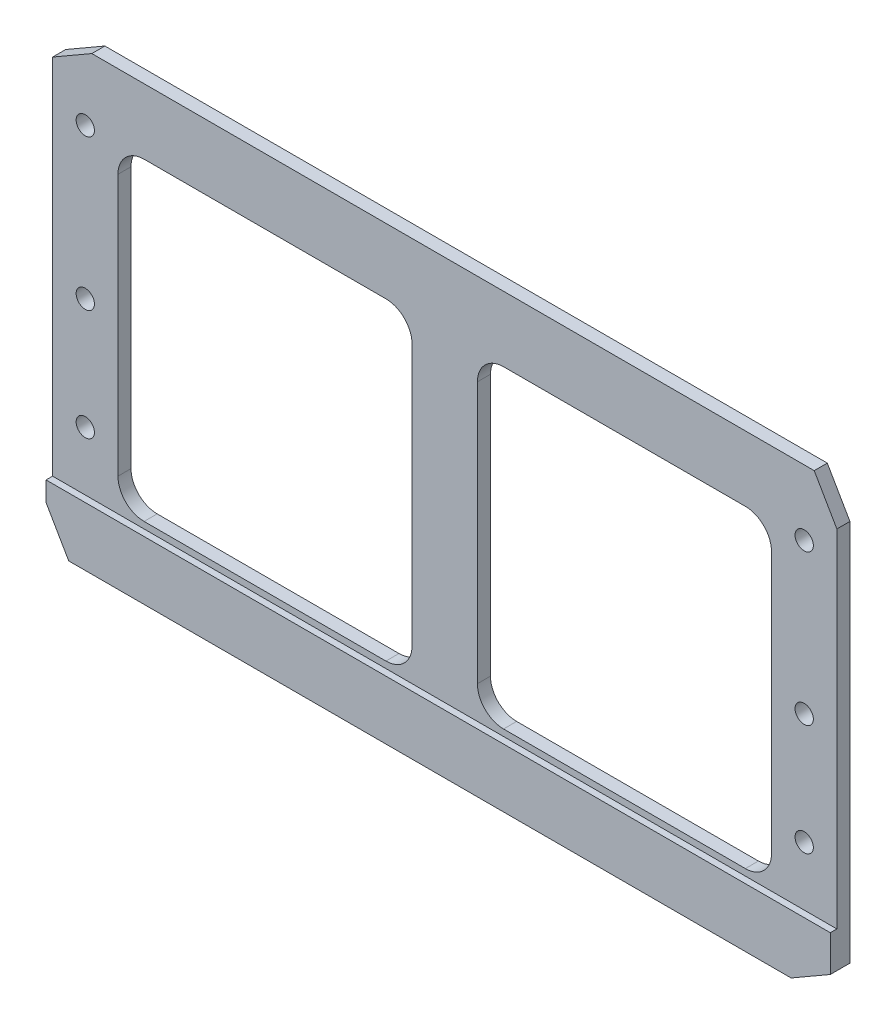
ISO-10303-21;
HEADER;
FILE_DESCRIPTION(('STEP AP214'),'2;1');
FILE_NAME('part.step','',(''),(''),'','','');
FILE_SCHEMA(('AUTOMOTIVE_DESIGN { 1 0 10303 214 1 1 1 1 }'));
ENDSEC;
DATA;
#1=APPLICATION_CONTEXT('core data for automotive mechanical design processes');
#2=APPLICATION_PROTOCOL_DEFINITION('international standard','automotive_design',2000,#1);
#3=PRODUCT_CONTEXT('',#1,'mechanical');
#4=PRODUCT('Part','Part','',(#3));
#5=PRODUCT_RELATED_PRODUCT_CATEGORY('part','',(#4));
#6=PRODUCT_DEFINITION_FORMATION('','',#4);
#7=PRODUCT_DEFINITION_CONTEXT('part definition',#1,'design');
#8=PRODUCT_DEFINITION('design','',#6,#7);
#9=PRODUCT_DEFINITION_SHAPE('','',#8);
#10=(LENGTH_UNIT() NAMED_UNIT(*) SI_UNIT(.MILLI.,.METRE.));
#11=(NAMED_UNIT(*) PLANE_ANGLE_UNIT() SI_UNIT($,.RADIAN.));
#12=(NAMED_UNIT(*) SI_UNIT($,.STERADIAN.) SOLID_ANGLE_UNIT());
#13=UNCERTAINTY_MEASURE_WITH_UNIT(LENGTH_MEASURE(1.E-05),#10,'distance_accuracy_value','');
#14=(GEOMETRIC_REPRESENTATION_CONTEXT(3) GLOBAL_UNCERTAINTY_ASSIGNED_CONTEXT((#13)) GLOBAL_UNIT_ASSIGNED_CONTEXT((#10,
#11,#12)) REPRESENTATION_CONTEXT('',''));
#15=CARTESIAN_POINT('',(0.,0.,0.));
#16=DIRECTION('',(0.,0.,1.));
#17=DIRECTION('',(1.,0.,0.));
#18=AXIS2_PLACEMENT_3D('',#15,#16,#17);
#19=CARTESIAN_POINT('',(-310.,-125.,10.));
#20=DIRECTION('',(0.,-1.,0.));
#21=DIRECTION('',(0.,0.,-1.));
#22=AXIS2_PLACEMENT_3D('',#19,#20,#21);
#23=PLANE('',#22);
#24=DIRECTION('',(0.,0.,-1.));
#25=VECTOR('',#24,1.);
#26=CARTESIAN_POINT('',(-300.,-125.,15.));
#27=LINE('',#26,#25);
#28=CARTESIAN_POINT('',(-300.,-125.,10.));
#29=VERTEX_POINT('',#28);
#30=CARTESIAN_POINT('',(-300.,-125.,15.));
#31=VERTEX_POINT('',#30);
#32=EDGE_CURVE('E185',#29,#31,#27,.F.);
#33=ORIENTED_EDGE('',*,*,#32,.T.);
#34=DIRECTION('',(-1.,0.,0.));
#35=VECTOR('',#34,1.);
#36=CARTESIAN_POINT('',(0.,-125.,15.));
#37=LINE('',#36,#35);
#38=CARTESIAN_POINT('',(300.,-125.,15.));
#39=VERTEX_POINT('',#38);
#40=EDGE_CURVE('E182',#31,#39,#37,.F.);
#41=ORIENTED_EDGE('',*,*,#40,.T.);
#42=DIRECTION('',(0.,0.,1.));
#43=VECTOR('',#42,1.);
#44=CARTESIAN_POINT('',(300.,-125.,15.));
#45=LINE('',#44,#43);
#46=CARTESIAN_POINT('',(300.,-125.,10.));
#47=VERTEX_POINT('',#46);
#48=EDGE_CURVE('E180',#39,#47,#45,.F.);
#49=ORIENTED_EDGE('',*,*,#48,.T.);
#50=DIRECTION('',(-1.,0.,0.));
#51=VECTOR('',#50,1.);
#52=CARTESIAN_POINT('',(0.,-125.,10.));
#53=LINE('',#52,#51);
#54=EDGE_CURVE('E189',#47,#29,#53,.T.);
#55=ORIENTED_EDGE('',*,*,#54,.T.);
#56=EDGE_LOOP('',(#33,#41,#49,#55));
#57=FACE_BOUND('',#56,.T.);
#58=ADVANCED_FACE('F16',(#57),#23,.F.);
#59=CARTESIAN_POINT('',(0.,0.,15.));
#60=DIRECTION('',(0.,0.,-1.));
#61=DIRECTION('',(-1.,0.,0.));
#62=AXIS2_PLACEMENT_3D('',#59,#60,#61);
#63=PLANE('',#62);
#64=ORIENTED_EDGE('',*,*,#40,.F.);
#65=DIRECTION('',(0.,1.,0.));
#66=VECTOR('',#65,1.);
#67=CARTESIAN_POINT('',(-300.,-170.,15.));
#68=LINE('',#67,#66);
#69=CARTESIAN_POINT('',(-300.,-140.,15.));
#70=VERTEX_POINT('',#69);
#71=EDGE_CURVE('E719',#31,#70,#68,.F.);
#72=ORIENTED_EDGE('',*,*,#71,.T.);
#73=DIRECTION('',(-0.5,0.86602540378444,0.));
#74=VECTOR('',#73,1.);
#75=CARTESIAN_POINT('',(-282.679491924312,-170.,15.));
#76=LINE('',#75,#74);
#77=CARTESIAN_POINT('',(-282.679491924312,-170.,15.));
#78=VERTEX_POINT('',#77);
#79=EDGE_CURVE('E728',#70,#78,#76,.F.);
#80=ORIENTED_EDGE('',*,*,#79,.T.);
#81=DIRECTION('',(1.,0.,0.));
#82=VECTOR('',#81,1.);
#83=CARTESIAN_POINT('',(-300.,-170.,15.));
#84=LINE('',#83,#82);
#85=CARTESIAN_POINT('',(270.,-170.,15.));
#86=VERTEX_POINT('',#85);
#87=EDGE_CURVE('E737',#78,#86,#84,.T.);
#88=ORIENTED_EDGE('',*,*,#87,.T.);
#89=DIRECTION('',(-0.866025403784439,-0.5,0.));
#90=VECTOR('',#89,1.);
#91=CARTESIAN_POINT('',(300.,-152.679491924311,15.));
#92=LINE('',#91,#90);
#93=CARTESIAN_POINT('',(300.,-152.679491924311,15.));
#94=VERTEX_POINT('',#93);
#95=EDGE_CURVE('E195',#86,#94,#92,.F.);
#96=ORIENTED_EDGE('',*,*,#95,.T.);
#97=DIRECTION('',(0.,1.,0.));
#98=VECTOR('',#97,1.);
#99=CARTESIAN_POINT('',(300.,-170.,15.));
#100=LINE('',#99,#98);
#101=EDGE_CURVE('E192',#94,#39,#100,.T.);
#102=ORIENTED_EDGE('',*,*,#101,.T.);
#103=EDGE_LOOP('',(#64,#72,#80,#88,#96,#102));
#104=FACE_BOUND('',#103,.T.);
#105=ADVANCED_FACE('F193',(#104),#63,.F.);
#106=CARTESIAN_POINT('',(0.,0.,10.));
#107=DIRECTION('',(0.,0.,-1.));
#108=DIRECTION('',(-1.,0.,0.));
#109=AXIS2_PLACEMENT_3D('',#106,#107,#108);
#110=PLANE('',#109);
#111=CARTESIAN_POINT('',(45.,100.,10.));
#112=DIRECTION('',(0.,0.,-1.));
#113=DIRECTION('',(-1.,0.,0.));
#114=AXIS2_PLACEMENT_3D('',#111,#112,#113);
#115=CIRCLE('',#114,20.);
#116=CARTESIAN_POINT('',(25.,100.,10.));
#117=VERTEX_POINT('',#116);
#118=CARTESIAN_POINT('',(45.,120.,10.));
#119=VERTEX_POINT('',#118);
#120=EDGE_CURVE('E299',#117,#119,#115,.T.);
#121=ORIENTED_EDGE('',*,*,#120,.T.);
#122=DIRECTION('',(-1.,0.,0.));
#123=VECTOR('',#122,1.);
#124=CARTESIAN_POINT('',(25.,120.,10.));
#125=LINE('',#124,#123);
#126=CARTESIAN_POINT('',(230.,120.,10.));
#127=VERTEX_POINT('',#126);
#128=EDGE_CURVE('E234',#119,#127,#125,.F.);
#129=ORIENTED_EDGE('',*,*,#128,.T.);
#130=CARTESIAN_POINT('',(230.,100.,10.));
#131=DIRECTION('',(0.,0.,-1.));
#132=DIRECTION('',(-1.,0.,0.));
#133=AXIS2_PLACEMENT_3D('',#130,#131,#132);
#134=CIRCLE('',#133,20.);
#135=CARTESIAN_POINT('',(250.,100.,10.));
#136=VERTEX_POINT('',#135);
#137=EDGE_CURVE('E301',#127,#136,#134,.T.);
#138=ORIENTED_EDGE('',*,*,#137,.T.);
#139=DIRECTION('',(0.,1.,0.));
#140=VECTOR('',#139,1.);
#141=CARTESIAN_POINT('',(250.,-120.,10.));
#142=LINE('',#141,#140);
#143=CARTESIAN_POINT('',(250.,-100.,10.));
#144=VERTEX_POINT('',#143);
#145=EDGE_CURVE('E132',#136,#144,#142,.F.);
#146=ORIENTED_EDGE('',*,*,#145,.T.);
#147=CARTESIAN_POINT('',(230.,-100.,10.));
#148=DIRECTION('',(0.,0.,-1.));
#149=DIRECTION('',(-1.,0.,0.));
#150=AXIS2_PLACEMENT_3D('',#147,#148,#149);
#151=CIRCLE('',#150,20.);
#152=CARTESIAN_POINT('',(230.,-120.,10.));
#153=VERTEX_POINT('',#152);
#154=EDGE_CURVE('E135',#144,#153,#151,.T.);
#155=ORIENTED_EDGE('',*,*,#154,.T.);
#156=DIRECTION('',(1.,0.,0.));
#157=VECTOR('',#156,1.);
#158=CARTESIAN_POINT('',(25.,-120.,10.));
#159=LINE('',#158,#157);
#160=CARTESIAN_POINT('',(45.,-120.,10.));
#161=VERTEX_POINT('',#160);
#162=EDGE_CURVE('E231',#153,#161,#159,.F.);
#163=ORIENTED_EDGE('',*,*,#162,.T.);
#164=CARTESIAN_POINT('',(45.,-100.,10.));
#165=DIRECTION('',(0.,0.,-1.));
#166=DIRECTION('',(-1.,0.,0.));
#167=AXIS2_PLACEMENT_3D('',#164,#165,#166);
#168=CIRCLE('',#167,20.);
#169=CARTESIAN_POINT('',(25.,-100.,10.));
#170=VERTEX_POINT('',#169);
#171=EDGE_CURVE('E296',#161,#170,#168,.T.);
#172=ORIENTED_EDGE('',*,*,#171,.T.);
#173=DIRECTION('',(0.,1.,0.));
#174=VECTOR('',#173,1.);
#175=CARTESIAN_POINT('',(25.,-120.,10.));
#176=LINE('',#175,#174);
#177=EDGE_CURVE('E227',#170,#117,#176,.T.);
#178=ORIENTED_EDGE('',*,*,#177,.T.);
#179=EDGE_LOOP('',(#121,#129,#138,#146,#155,#163,#172,#178));
#180=FACE_BOUND('',#179,.T.);
#181=DIRECTION('',(0.,1.,0.));
#182=VECTOR('',#181,1.);
#183=CARTESIAN_POINT('',(300.,-170.,10.));
#184=LINE('',#183,#182);
#185=CARTESIAN_POINT('',(300.,140.,10.));
#186=VERTEX_POINT('',#185);
#187=EDGE_CURVE('E144',#47,#186,#184,.T.);
#188=ORIENTED_EDGE('',*,*,#187,.T.);
#189=DIRECTION('',(0.5,-0.866025403784439,0.));
#190=VECTOR('',#189,1.);
#191=CARTESIAN_POINT('',(282.679491924311,170.,10.));
#192=LINE('',#191,#190);
#193=CARTESIAN_POINT('',(282.679491924311,170.,10.));
#194=VERTEX_POINT('',#193);
#195=EDGE_CURVE('E233',#186,#194,#192,.F.);
#196=ORIENTED_EDGE('',*,*,#195,.T.);
#197=DIRECTION('',(1.,0.,0.));
#198=VECTOR('',#197,1.);
#199=CARTESIAN_POINT('',(-300.,170.,10.));
#200=LINE('',#199,#198);
#201=CARTESIAN_POINT('',(-270.,170.,10.));
#202=VERTEX_POINT('',#201);
#203=EDGE_CURVE('E711',#194,#202,#200,.F.);
#204=ORIENTED_EDGE('',*,*,#203,.T.);
#205=DIRECTION('',(0.86602540378444,0.5,0.));
#206=VECTOR('',#205,1.);
#207=CARTESIAN_POINT('',(-300.,152.679491924311,10.));
#208=LINE('',#207,#206);
#209=CARTESIAN_POINT('',(-300.,152.679491924311,10.));
#210=VERTEX_POINT('',#209);
#211=EDGE_CURVE('E713',#202,#210,#208,.F.);
#212=ORIENTED_EDGE('',*,*,#211,.T.);
#213=DIRECTION('',(0.,1.,0.));
#214=VECTOR('',#213,1.);
#215=CARTESIAN_POINT('',(-300.,-170.,10.));
#216=LINE('',#215,#214);
#217=EDGE_CURVE('E722',#210,#29,#216,.F.);
#218=ORIENTED_EDGE('',*,*,#217,.T.);
#219=ORIENTED_EDGE('',*,*,#54,.F.);
#220=EDGE_LOOP('',(#188,#196,#204,#212,#218,#219));
#221=FACE_BOUND('',#220,.T.);
#222=CARTESIAN_POINT('',(-275.,5.,10.));
#223=DIRECTION('',(0.,0.,1.));
#224=DIRECTION('',(1.,0.,0.));
#225=AXIS2_PLACEMENT_3D('',#222,#223,#224);
#226=CIRCLE('',#225,7.);
#227=CARTESIAN_POINT('',(-268.,5.,10.));
#228=VERTEX_POINT('',#227);
#229=EDGE_CURVE('E306',#228,#228,#226,.F.);
#230=ORIENTED_EDGE('',*,*,#229,.T.);
#231=EDGE_LOOP('',(#230));
#232=FACE_BOUND('',#231,.T.);
#233=CARTESIAN_POINT('',(275.,120.,10.));
#234=DIRECTION('',(0.,0.,1.));
#235=DIRECTION('',(1.,0.,0.));
#236=AXIS2_PLACEMENT_3D('',#233,#234,#235);
#237=CIRCLE('',#236,7.);
#238=CARTESIAN_POINT('',(282.,120.,10.));
#239=VERTEX_POINT('',#238);
#240=EDGE_CURVE('E312',#239,#239,#237,.F.);
#241=ORIENTED_EDGE('',*,*,#240,.T.);
#242=EDGE_LOOP('',(#241));
#243=FACE_BOUND('',#242,.T.);
#244=CARTESIAN_POINT('',(275.,-80.,10.));
#245=DIRECTION('',(0.,0.,1.));
#246=DIRECTION('',(1.,0.,0.));
#247=AXIS2_PLACEMENT_3D('',#244,#245,#246);
#248=CIRCLE('',#247,7.);
#249=CARTESIAN_POINT('',(282.,-80.,10.));
#250=VERTEX_POINT('',#249);
#251=EDGE_CURVE('E19',#250,#250,#248,.F.);
#252=ORIENTED_EDGE('',*,*,#251,.T.);
#253=EDGE_LOOP('',(#252));
#254=FACE_BOUND('',#253,.T.);
#255=CARTESIAN_POINT('',(275.,5.00000000000009,10.));
#256=DIRECTION('',(0.,0.,1.));
#257=DIRECTION('',(1.,0.,0.));
#258=AXIS2_PLACEMENT_3D('',#255,#256,#257);
#259=CIRCLE('',#258,7.);
#260=CARTESIAN_POINT('',(282.,5.00000000000009,10.));
#261=VERTEX_POINT('',#260);
#262=EDGE_CURVE('E314',#261,#261,#259,.F.);
#263=ORIENTED_EDGE('',*,*,#262,.T.);
#264=EDGE_LOOP('',(#263));
#265=FACE_BOUND('',#264,.T.);
#266=CARTESIAN_POINT('',(-275.,-80.,10.));
#267=DIRECTION('',(0.,0.,1.));
#268=DIRECTION('',(1.,0.,0.));
#269=AXIS2_PLACEMENT_3D('',#266,#267,#268);
#270=CIRCLE('',#269,7.);
#271=CARTESIAN_POINT('',(-268.,-80.,10.));
#272=VERTEX_POINT('',#271);
#273=EDGE_CURVE('E309',#272,#272,#270,.F.);
#274=ORIENTED_EDGE('',*,*,#273,.T.);
#275=EDGE_LOOP('',(#274));
#276=FACE_BOUND('',#275,.T.);
#277=CARTESIAN_POINT('',(-275.,120.,10.));
#278=DIRECTION('',(0.,0.,1.));
#279=DIRECTION('',(1.,0.,0.));
#280=AXIS2_PLACEMENT_3D('',#277,#278,#279);
#281=CIRCLE('',#280,7.);
#282=CARTESIAN_POINT('',(-268.,120.,10.));
#283=VERTEX_POINT('',#282);
#284=EDGE_CURVE('E199',#283,#283,#281,.F.);
#285=ORIENTED_EDGE('',*,*,#284,.T.);
#286=EDGE_LOOP('',(#285));
#287=FACE_BOUND('',#286,.T.);
#288=CARTESIAN_POINT('',(-230.,-100.,10.));
#289=DIRECTION('',(0.,0.,-1.));
#290=DIRECTION('',(-1.,0.,0.));
#291=AXIS2_PLACEMENT_3D('',#288,#289,#290);
#292=CIRCLE('',#291,20.);
#293=CARTESIAN_POINT('',(-230.,-120.,10.));
#294=VERTEX_POINT('',#293);
#295=CARTESIAN_POINT('',(-250.,-100.,10.));
#296=VERTEX_POINT('',#295);
#297=EDGE_CURVE('E293',#294,#296,#292,.T.);
#298=ORIENTED_EDGE('',*,*,#297,.T.);
#299=DIRECTION('',(0.,1.,0.));
#300=VECTOR('',#299,1.);
#301=CARTESIAN_POINT('',(-250.,-120.,10.));
#302=LINE('',#301,#300);
#303=CARTESIAN_POINT('',(-250.,100.,10.));
#304=VERTEX_POINT('',#303);
#305=EDGE_CURVE('E222',#304,#296,#302,.F.);
#306=ORIENTED_EDGE('',*,*,#305,.F.);
#307=CARTESIAN_POINT('',(-230.,100.,10.));
#308=DIRECTION('',(0.,0.,-1.));
#309=DIRECTION('',(-1.,0.,0.));
#310=AXIS2_PLACEMENT_3D('',#307,#308,#309);
#311=CIRCLE('',#310,20.);
#312=CARTESIAN_POINT('',(-230.,120.,10.));
#313=VERTEX_POINT('',#312);
#314=EDGE_CURVE('E215',#304,#313,#311,.T.);
#315=ORIENTED_EDGE('',*,*,#314,.T.);
#316=DIRECTION('',(1.,0.,0.));
#317=VECTOR('',#316,1.);
#318=CARTESIAN_POINT('',(-25.,120.,10.));
#319=LINE('',#318,#317);
#320=CARTESIAN_POINT('',(-45.,120.,10.));
#321=VERTEX_POINT('',#320);
#322=EDGE_CURVE('E212',#321,#313,#319,.F.);
#323=ORIENTED_EDGE('',*,*,#322,.F.);
#324=CARTESIAN_POINT('',(-45.,100.,10.));
#325=DIRECTION('',(0.,0.,-1.));
#326=DIRECTION('',(-1.,0.,0.));
#327=AXIS2_PLACEMENT_3D('',#324,#325,#326);
#328=CIRCLE('',#327,20.);
#329=CARTESIAN_POINT('',(-25.,100.,10.));
#330=VERTEX_POINT('',#329);
#331=EDGE_CURVE('E288',#321,#330,#328,.T.);
#332=ORIENTED_EDGE('',*,*,#331,.T.);
#333=DIRECTION('',(0.,1.,0.));
#334=VECTOR('',#333,1.);
#335=CARTESIAN_POINT('',(-25.,-120.,10.));
#336=LINE('',#335,#334);
#337=CARTESIAN_POINT('',(-25.,-100.,10.));
#338=VERTEX_POINT('',#337);
#339=EDGE_CURVE('E207',#338,#330,#336,.T.);
#340=ORIENTED_EDGE('',*,*,#339,.F.);
#341=CARTESIAN_POINT('',(-45.,-100.,10.));
#342=DIRECTION('',(0.,0.,-1.));
#343=DIRECTION('',(-1.,0.,0.));
#344=AXIS2_PLACEMENT_3D('',#341,#342,#343);
#345=CIRCLE('',#344,20.);
#346=CARTESIAN_POINT('',(-45.,-120.,10.));
#347=VERTEX_POINT('',#346);
#348=EDGE_CURVE('E291',#338,#347,#345,.T.);
#349=ORIENTED_EDGE('',*,*,#348,.T.);
#350=DIRECTION('',(1.,0.,0.));
#351=VECTOR('',#350,1.);
#352=CARTESIAN_POINT('',(-25.,-120.,10.));
#353=LINE('',#352,#351);
#354=EDGE_CURVE('E217',#294,#347,#353,.T.);
#355=ORIENTED_EDGE('',*,*,#354,.F.);
#356=EDGE_LOOP('',(#298,#306,#315,#323,#332,#340,#349,#355));
#357=FACE_BOUND('',#356,.T.);
#358=ADVANCED_FACE('F321',(#180,#221,#232,#243,#254,#265,#276,#287,#357),#110,.F.);
#359=CARTESIAN_POINT('',(275.,-80.,15.));
#360=DIRECTION('',(0.,0.,1.));
#361=DIRECTION('',(1.,0.,0.));
#362=AXIS2_PLACEMENT_3D('',#359,#360,#361);
#363=CYLINDRICAL_SURFACE('',#362,7.);
#364=CARTESIAN_POINT('',(275.,-80.,0.));
#365=DIRECTION('',(0.,0.,1.));
#366=DIRECTION('',(1.,0.,0.));
#367=AXIS2_PLACEMENT_3D('',#364,#365,#366);
#368=CIRCLE('',#367,7.);
#369=CARTESIAN_POINT('',(282.,-80.,0.));
#370=VERTEX_POINT('',#369);
#371=EDGE_CURVE('E285',#370,#370,#368,.T.);
#372=ORIENTED_EDGE('',*,*,#371,.F.);
#373=EDGE_LOOP('',(#372));
#374=FACE_BOUND('',#373,.T.);
#375=ORIENTED_EDGE('',*,*,#251,.F.);
#376=EDGE_LOOP('',(#375));
#377=FACE_BOUND('',#376,.T.);
#378=ADVANCED_FACE('F323',(#374,#377),#363,.F.);
#379=CARTESIAN_POINT('',(275.,5.00000000000009,15.));
#380=DIRECTION('',(0.,0.,1.));
#381=DIRECTION('',(1.,0.,0.));
#382=AXIS2_PLACEMENT_3D('',#379,#380,#381);
#383=CYLINDRICAL_SURFACE('',#382,7.);
#384=CARTESIAN_POINT('',(275.,5.00000000000009,0.));
#385=DIRECTION('',(0.,0.,1.));
#386=DIRECTION('',(1.,0.,0.));
#387=AXIS2_PLACEMENT_3D('',#384,#385,#386);
#388=CIRCLE('',#387,7.);
#389=CARTESIAN_POINT('',(282.,5.00000000000009,0.));
#390=VERTEX_POINT('',#389);
#391=EDGE_CURVE('E282',#390,#390,#388,.T.);
#392=ORIENTED_EDGE('',*,*,#391,.F.);
#393=EDGE_LOOP('',(#392));
#394=FACE_BOUND('',#393,.T.);
#395=ORIENTED_EDGE('',*,*,#262,.F.);
#396=EDGE_LOOP('',(#395));
#397=FACE_BOUND('',#396,.T.);
#398=ADVANCED_FACE('F325',(#394,#397),#383,.F.);
#399=CARTESIAN_POINT('',(275.,120.,15.));
#400=DIRECTION('',(0.,0.,1.));
#401=DIRECTION('',(1.,0.,0.));
#402=AXIS2_PLACEMENT_3D('',#399,#400,#401);
#403=CYLINDRICAL_SURFACE('',#402,7.);
#404=CARTESIAN_POINT('',(275.,120.,0.));
#405=DIRECTION('',(0.,0.,1.));
#406=DIRECTION('',(1.,0.,0.));
#407=AXIS2_PLACEMENT_3D('',#404,#405,#406);
#408=CIRCLE('',#407,7.);
#409=CARTESIAN_POINT('',(282.,120.,0.));
#410=VERTEX_POINT('',#409);
#411=EDGE_CURVE('E279',#410,#410,#408,.T.);
#412=ORIENTED_EDGE('',*,*,#411,.F.);
#413=EDGE_LOOP('',(#412));
#414=FACE_BOUND('',#413,.T.);
#415=ORIENTED_EDGE('',*,*,#240,.F.);
#416=EDGE_LOOP('',(#415));
#417=FACE_BOUND('',#416,.T.);
#418=ADVANCED_FACE('F334',(#414,#417),#403,.F.);
#419=CARTESIAN_POINT('',(-275.,-80.,15.));
#420=DIRECTION('',(0.,0.,1.));
#421=DIRECTION('',(1.,0.,0.));
#422=AXIS2_PLACEMENT_3D('',#419,#420,#421);
#423=CYLINDRICAL_SURFACE('',#422,7.);
#424=CARTESIAN_POINT('',(-275.,-80.,0.));
#425=DIRECTION('',(0.,0.,1.));
#426=DIRECTION('',(1.,0.,0.));
#427=AXIS2_PLACEMENT_3D('',#424,#425,#426);
#428=CIRCLE('',#427,7.);
#429=CARTESIAN_POINT('',(-268.,-80.,0.));
#430=VERTEX_POINT('',#429);
#431=EDGE_CURVE('E276',#430,#430,#428,.T.);
#432=ORIENTED_EDGE('',*,*,#431,.F.);
#433=EDGE_LOOP('',(#432));
#434=FACE_BOUND('',#433,.T.);
#435=ORIENTED_EDGE('',*,*,#273,.F.);
#436=EDGE_LOOP('',(#435));
#437=FACE_BOUND('',#436,.T.);
#438=ADVANCED_FACE('F449',(#434,#437),#423,.F.);
#439=CARTESIAN_POINT('',(-275.,5.,15.));
#440=DIRECTION('',(0.,0.,1.));
#441=DIRECTION('',(1.,0.,0.));
#442=AXIS2_PLACEMENT_3D('',#439,#440,#441);
#443=CYLINDRICAL_SURFACE('',#442,7.);
#444=CARTESIAN_POINT('',(-275.,5.,0.));
#445=DIRECTION('',(0.,0.,1.));
#446=DIRECTION('',(1.,0.,0.));
#447=AXIS2_PLACEMENT_3D('',#444,#445,#446);
#448=CIRCLE('',#447,7.);
#449=CARTESIAN_POINT('',(-268.,5.,0.));
#450=VERTEX_POINT('',#449);
#451=EDGE_CURVE('E273',#450,#450,#448,.T.);
#452=ORIENTED_EDGE('',*,*,#451,.F.);
#453=EDGE_LOOP('',(#452));
#454=FACE_BOUND('',#453,.T.);
#455=ORIENTED_EDGE('',*,*,#229,.F.);
#456=EDGE_LOOP('',(#455));
#457=FACE_BOUND('',#456,.T.);
#458=ADVANCED_FACE('F445',(#454,#457),#443,.F.);
#459=CARTESIAN_POINT('',(-275.,120.,15.));
#460=DIRECTION('',(0.,0.,1.));
#461=DIRECTION('',(1.,0.,0.));
#462=AXIS2_PLACEMENT_3D('',#459,#460,#461);
#463=CYLINDRICAL_SURFACE('',#462,7.);
#464=CARTESIAN_POINT('',(-275.,120.,0.));
#465=DIRECTION('',(0.,0.,1.));
#466=DIRECTION('',(1.,0.,0.));
#467=AXIS2_PLACEMENT_3D('',#464,#465,#466);
#468=CIRCLE('',#467,7.);
#469=CARTESIAN_POINT('',(-268.,120.,0.));
#470=VERTEX_POINT('',#469);
#471=EDGE_CURVE('E269',#470,#470,#468,.T.);
#472=ORIENTED_EDGE('',*,*,#471,.F.);
#473=EDGE_LOOP('',(#472));
#474=FACE_BOUND('',#473,.T.);
#475=ORIENTED_EDGE('',*,*,#284,.F.);
#476=EDGE_LOOP('',(#475));
#477=FACE_BOUND('',#476,.T.);
#478=ADVANCED_FACE('F442',(#474,#477),#463,.F.);
#479=CARTESIAN_POINT('',(300.,-170.,15.));
#480=DIRECTION('',(-1.,0.,0.));
#481=DIRECTION('',(0.,0.,1.));
#482=AXIS2_PLACEMENT_3D('',#479,#480,#481);
#483=PLANE('',#482);
#484=ORIENTED_EDGE('',*,*,#48,.F.);
#485=ORIENTED_EDGE('',*,*,#101,.F.);
#486=DIRECTION('',(0.,0.,1.));
#487=VECTOR('',#486,1.);
#488=CARTESIAN_POINT('',(300.,-152.679491924311,15.));
#489=LINE('',#488,#487);
#490=CARTESIAN_POINT('',(300.,-152.679491924311,0.));
#491=VERTEX_POINT('',#490);
#492=EDGE_CURVE('E203',#94,#491,#489,.F.);
#493=ORIENTED_EDGE('',*,*,#492,.T.);
#494=DIRECTION('',(0.,1.,0.));
#495=VECTOR('',#494,1.);
#496=CARTESIAN_POINT('',(300.,0.,0.));
#497=LINE('',#496,#495);
#498=CARTESIAN_POINT('',(300.,140.,0.));
#499=VERTEX_POINT('',#498);
#500=EDGE_CURVE('E272',#499,#491,#497,.F.);
#501=ORIENTED_EDGE('',*,*,#500,.F.);
#502=DIRECTION('',(0.,0.,1.));
#503=VECTOR('',#502,1.);
#504=CARTESIAN_POINT('',(300.,140.,15.));
#505=LINE('',#504,#503);
#506=EDGE_CURVE('E703',#499,#186,#505,.T.);
#507=ORIENTED_EDGE('',*,*,#506,.T.);
#508=ORIENTED_EDGE('',*,*,#187,.F.);
#509=EDGE_LOOP('',(#484,#485,#493,#501,#507,#508));
#510=FACE_BOUND('',#509,.T.);
#511=ADVANCED_FACE('F201',(#510),#483,.F.);
#512=CARTESIAN_POINT('',(300.,-152.679491924311,15.));
#513=DIRECTION('',(-0.5,0.866025403784439,0.));
#514=DIRECTION('',(-0.866025403784439,-0.5,0.));
#515=AXIS2_PLACEMENT_3D('',#512,#513,#514);
#516=PLANE('',#515);
#517=DIRECTION('',(0.,0.,1.));
#518=VECTOR('',#517,1.);
#519=CARTESIAN_POINT('',(270.,-170.,15.));
#520=LINE('',#519,#518);
#521=CARTESIAN_POINT('',(270.,-170.,0.));
#522=VERTEX_POINT('',#521);
#523=EDGE_CURVE('E734',#86,#522,#520,.F.);
#524=ORIENTED_EDGE('',*,*,#523,.T.);
#525=DIRECTION('',(-0.866025403784439,-0.5,0.));
#526=VECTOR('',#525,1.);
#527=CARTESIAN_POINT('',(300.,-152.679491924311,0.));
#528=LINE('',#527,#526);
#529=EDGE_CURVE('E745',#491,#522,#528,.T.);
#530=ORIENTED_EDGE('',*,*,#529,.F.);
#531=ORIENTED_EDGE('',*,*,#492,.F.);
#532=ORIENTED_EDGE('',*,*,#95,.F.);
#533=EDGE_LOOP('',(#524,#530,#531,#532));
#534=FACE_BOUND('',#533,.T.);
#535=ADVANCED_FACE('F435',(#534),#516,.F.);
#536=CARTESIAN_POINT('',(-300.,-170.,15.));
#537=DIRECTION('',(0.,1.,0.));
#538=DIRECTION('',(0.,0.,1.));
#539=AXIS2_PLACEMENT_3D('',#536,#537,#538);
#540=PLANE('',#539);
#541=ORIENTED_EDGE('',*,*,#523,.F.);
#542=ORIENTED_EDGE('',*,*,#87,.F.);
#543=DIRECTION('',(0.,0.,1.));
#544=VECTOR('',#543,1.);
#545=CARTESIAN_POINT('',(-282.679491924312,-170.,15.));
#546=LINE('',#545,#544);
#547=CARTESIAN_POINT('',(-282.679491924312,-170.,0.));
#548=VERTEX_POINT('',#547);
#549=EDGE_CURVE('E731',#78,#548,#546,.F.);
#550=ORIENTED_EDGE('',*,*,#549,.T.);
#551=DIRECTION('',(-1.,0.,0.));
#552=VECTOR('',#551,1.);
#553=CARTESIAN_POINT('',(0.,-170.,0.));
#554=LINE('',#553,#552);
#555=EDGE_CURVE('E750',#522,#548,#554,.T.);
#556=ORIENTED_EDGE('',*,*,#555,.F.);
#557=EDGE_LOOP('',(#541,#542,#550,#556));
#558=FACE_BOUND('',#557,.T.);
#559=ADVANCED_FACE('F431',(#558),#540,.F.);
#560=CARTESIAN_POINT('',(-282.679491924312,-170.,15.));
#561=DIRECTION('',(0.86602540378444,0.5,0.));
#562=DIRECTION('',(-0.5,0.86602540378444,0.));
#563=AXIS2_PLACEMENT_3D('',#560,#561,#562);
#564=PLANE('',#563);
#565=DIRECTION('',(0.,0.,-1.));
#566=VECTOR('',#565,1.);
#567=CARTESIAN_POINT('',(-300.,-140.,15.));
#568=LINE('',#567,#566);
#569=CARTESIAN_POINT('',(-300.,-140.,0.));
#570=VERTEX_POINT('',#569);
#571=EDGE_CURVE('E725',#70,#570,#568,.T.);
#572=ORIENTED_EDGE('',*,*,#571,.T.);
#573=DIRECTION('',(-0.5,0.866025403784441,0.));
#574=VECTOR('',#573,1.);
#575=CARTESIAN_POINT('',(-282.679491924312,-170.,0.));
#576=LINE('',#575,#574);
#577=EDGE_CURVE('E792',#548,#570,#576,.T.);
#578=ORIENTED_EDGE('',*,*,#577,.F.);
#579=ORIENTED_EDGE('',*,*,#549,.F.);
#580=ORIENTED_EDGE('',*,*,#79,.F.);
#581=EDGE_LOOP('',(#572,#578,#579,#580));
#582=FACE_BOUND('',#581,.T.);
#583=ADVANCED_FACE('F427',(#582),#564,.F.);
#584=CARTESIAN_POINT('',(-300.,-170.,15.));
#585=DIRECTION('',(1.,0.,0.));
#586=DIRECTION('',(0.,0.,-1.));
#587=AXIS2_PLACEMENT_3D('',#584,#585,#586);
#588=PLANE('',#587);
#589=ORIENTED_EDGE('',*,*,#32,.F.);
#590=ORIENTED_EDGE('',*,*,#217,.F.);
#591=DIRECTION('',(0.,0.,1.));
#592=VECTOR('',#591,1.);
#593=CARTESIAN_POINT('',(-300.,152.679491924311,15.));
#594=LINE('',#593,#592);
#595=CARTESIAN_POINT('',(-300.,152.679491924311,0.));
#596=VERTEX_POINT('',#595);
#597=EDGE_CURVE('E716',#210,#596,#594,.F.);
#598=ORIENTED_EDGE('',*,*,#597,.T.);
#599=DIRECTION('',(0.,1.,0.));
#600=VECTOR('',#599,1.);
#601=CARTESIAN_POINT('',(-300.,0.,0.));
#602=LINE('',#601,#600);
#603=EDGE_CURVE('E789',#570,#596,#602,.T.);
#604=ORIENTED_EDGE('',*,*,#603,.F.);
#605=ORIENTED_EDGE('',*,*,#571,.F.);
#606=ORIENTED_EDGE('',*,*,#71,.F.);
#607=EDGE_LOOP('',(#589,#590,#598,#604,#605,#606));
#608=FACE_BOUND('',#607,.T.);
#609=ADVANCED_FACE('F423',(#608),#588,.F.);
#610=CARTESIAN_POINT('',(-300.,152.679491924311,15.));
#611=DIRECTION('',(0.5,-0.86602540378444,0.));
#612=DIRECTION('',(0.86602540378444,0.5,0.));
#613=AXIS2_PLACEMENT_3D('',#610,#611,#612);
#614=PLANE('',#613);
#615=DIRECTION('',(0.,0.,-1.));
#616=VECTOR('',#615,1.);
#617=CARTESIAN_POINT('',(-270.,170.,15.));
#618=LINE('',#617,#616);
#619=CARTESIAN_POINT('',(-270.,170.,0.));
#620=VERTEX_POINT('',#619);
#621=EDGE_CURVE('E708',#202,#620,#618,.T.);
#622=ORIENTED_EDGE('',*,*,#621,.T.);
#623=DIRECTION('',(0.86602540378444,0.5,0.));
#624=VECTOR('',#623,1.);
#625=CARTESIAN_POINT('',(-300.,152.679491924311,0.));
#626=LINE('',#625,#624);
#627=EDGE_CURVE('E786',#596,#620,#626,.T.);
#628=ORIENTED_EDGE('',*,*,#627,.F.);
#629=ORIENTED_EDGE('',*,*,#597,.F.);
#630=ORIENTED_EDGE('',*,*,#211,.F.);
#631=EDGE_LOOP('',(#622,#628,#629,#630));
#632=FACE_BOUND('',#631,.T.);
#633=ADVANCED_FACE('F419',(#632),#614,.F.);
#634=CARTESIAN_POINT('',(-300.,170.,15.));
#635=DIRECTION('',(0.,-1.,0.));
#636=DIRECTION('',(0.,0.,-1.));
#637=AXIS2_PLACEMENT_3D('',#634,#635,#636);
#638=PLANE('',#637);
#639=ORIENTED_EDGE('',*,*,#203,.F.);
#640=DIRECTION('',(0.,0.,1.));
#641=VECTOR('',#640,1.);
#642=CARTESIAN_POINT('',(282.679491924311,170.,15.));
#643=LINE('',#642,#641);
#644=CARTESIAN_POINT('',(282.679491924311,170.,0.));
#645=VERTEX_POINT('',#644);
#646=EDGE_CURVE('E705',#194,#645,#643,.F.);
#647=ORIENTED_EDGE('',*,*,#646,.T.);
#648=DIRECTION('',(-1.,0.,0.));
#649=VECTOR('',#648,1.);
#650=CARTESIAN_POINT('',(0.,170.,0.));
#651=LINE('',#650,#649);
#652=EDGE_CURVE('E784',#620,#645,#651,.F.);
#653=ORIENTED_EDGE('',*,*,#652,.F.);
#654=ORIENTED_EDGE('',*,*,#621,.F.);
#655=EDGE_LOOP('',(#639,#647,#653,#654));
#656=FACE_BOUND('',#655,.T.);
#657=ADVANCED_FACE('F415',(#656),#638,.F.);
#658=CARTESIAN_POINT('',(282.679491924311,170.,15.));
#659=DIRECTION('',(-0.866025403784439,-0.5,0.));
#660=DIRECTION('',(0.5,-0.866025403784439,0.));
#661=AXIS2_PLACEMENT_3D('',#658,#659,#660);
#662=PLANE('',#661);
#663=ORIENTED_EDGE('',*,*,#506,.F.);
#664=DIRECTION('',(0.5,-0.866025403784439,0.));
#665=VECTOR('',#664,1.);
#666=CARTESIAN_POINT('',(282.679491924311,170.,0.));
#667=LINE('',#666,#665);
#668=EDGE_CURVE('E756',#645,#499,#667,.T.);
#669=ORIENTED_EDGE('',*,*,#668,.F.);
#670=ORIENTED_EDGE('',*,*,#646,.F.);
#671=ORIENTED_EDGE('',*,*,#195,.F.);
#672=EDGE_LOOP('',(#663,#669,#670,#671));
#673=FACE_BOUND('',#672,.T.);
#674=ADVANCED_FACE('F411',(#673),#662,.F.);
#675=CARTESIAN_POINT('',(25.,-120.,0.));
#676=DIRECTION('',(0.,-1.,0.));
#677=DIRECTION('',(0.,0.,-1.));
#678=AXIS2_PLACEMENT_3D('',#675,#676,#677);
#679=PLANE('',#678);
#680=ORIENTED_EDGE('',*,*,#162,.F.);
#681=DIRECTION('',(0.,0.,-1.));
#682=VECTOR('',#681,1.);
#683=CARTESIAN_POINT('',(230.,-120.,0.));
#684=LINE('',#683,#682);
#685=CARTESIAN_POINT('',(230.,-120.,0.));
#686=VERTEX_POINT('',#685);
#687=EDGE_CURVE('E239',#153,#686,#684,.T.);
#688=ORIENTED_EDGE('',*,*,#687,.T.);
#689=DIRECTION('',(-1.,0.,0.));
#690=VECTOR('',#689,1.);
#691=CARTESIAN_POINT('',(0.,-120.,0.));
#692=LINE('',#691,#690);
#693=CARTESIAN_POINT('',(45.,-120.,0.));
#694=VERTEX_POINT('',#693);
#695=EDGE_CURVE('E268',#694,#686,#692,.F.);
#696=ORIENTED_EDGE('',*,*,#695,.F.);
#697=DIRECTION('',(0.,0.,-1.));
#698=VECTOR('',#697,1.);
#699=CARTESIAN_POINT('',(45.,-120.,0.));
#700=LINE('',#699,#698);
#701=EDGE_CURVE('E298',#694,#161,#700,.F.);
#702=ORIENTED_EDGE('',*,*,#701,.T.);
#703=EDGE_LOOP('',(#680,#688,#696,#702));
#704=FACE_BOUND('',#703,.T.);
#705=ADVANCED_FACE('F407',(#704),#679,.F.);
#706=CARTESIAN_POINT('',(230.,-100.,0.));
#707=DIRECTION('',(0.,0.,-1.));
#708=DIRECTION('',(-1.,0.,0.));
#709=AXIS2_PLACEMENT_3D('',#706,#707,#708);
#710=CYLINDRICAL_SURFACE('',#709,20.);
#711=ORIENTED_EDGE('',*,*,#154,.F.);
#712=DIRECTION('',(0.,0.,-1.));
#713=VECTOR('',#712,1.);
#714=CARTESIAN_POINT('',(250.,-100.,0.));
#715=LINE('',#714,#713);
#716=CARTESIAN_POINT('',(250.,-100.,0.));
#717=VERTEX_POINT('',#716);
#718=EDGE_CURVE('E238',#144,#717,#715,.T.);
#719=ORIENTED_EDGE('',*,*,#718,.T.);
#720=CARTESIAN_POINT('',(230.,-100.,0.));
#721=DIRECTION('',(0.,0.,-1.));
#722=DIRECTION('',(-1.,0.,0.));
#723=AXIS2_PLACEMENT_3D('',#720,#721,#722);
#724=CIRCLE('',#723,20.);
#725=EDGE_CURVE('E265',#686,#717,#724,.F.);
#726=ORIENTED_EDGE('',*,*,#725,.F.);
#727=ORIENTED_EDGE('',*,*,#687,.F.);
#728=EDGE_LOOP('',(#711,#719,#726,#727));
#729=FACE_BOUND('',#728,.T.);
#730=ADVANCED_FACE('F403',(#729),#710,.F.);
#731=CARTESIAN_POINT('',(250.,-120.,0.));
#732=DIRECTION('',(1.,0.,0.));
#733=DIRECTION('',(0.,0.,-1.));
#734=AXIS2_PLACEMENT_3D('',#731,#732,#733);
#735=PLANE('',#734);
#736=ORIENTED_EDGE('',*,*,#145,.F.);
#737=DIRECTION('',(0.,0.,-1.));
#738=VECTOR('',#737,1.);
#739=CARTESIAN_POINT('',(250.,100.,0.));
#740=LINE('',#739,#738);
#741=CARTESIAN_POINT('',(250.,100.,0.));
#742=VERTEX_POINT('',#741);
#743=EDGE_CURVE('E237',#136,#742,#740,.T.);
#744=ORIENTED_EDGE('',*,*,#743,.T.);
#745=DIRECTION('',(0.,1.,0.));
#746=VECTOR('',#745,1.);
#747=CARTESIAN_POINT('',(250.,0.,0.));
#748=LINE('',#747,#746);
#749=EDGE_CURVE('E264',#717,#742,#748,.T.);
#750=ORIENTED_EDGE('',*,*,#749,.F.);
#751=ORIENTED_EDGE('',*,*,#718,.F.);
#752=EDGE_LOOP('',(#736,#744,#750,#751));
#753=FACE_BOUND('',#752,.T.);
#754=ADVANCED_FACE('F399',(#753),#735,.F.);
#755=CARTESIAN_POINT('',(230.,100.,0.));
#756=DIRECTION('',(0.,0.,-1.));
#757=DIRECTION('',(-1.,0.,0.));
#758=AXIS2_PLACEMENT_3D('',#755,#756,#757);
#759=CYLINDRICAL_SURFACE('',#758,20.);
#760=ORIENTED_EDGE('',*,*,#137,.F.);
#761=DIRECTION('',(0.,0.,1.));
#762=VECTOR('',#761,1.);
#763=CARTESIAN_POINT('',(230.,120.,0.));
#764=LINE('',#763,#762);
#765=CARTESIAN_POINT('',(230.,120.,0.));
#766=VERTEX_POINT('',#765);
#767=EDGE_CURVE('E236',#127,#766,#764,.F.);
#768=ORIENTED_EDGE('',*,*,#767,.T.);
#769=CARTESIAN_POINT('',(230.,100.,0.));
#770=DIRECTION('',(0.,0.,-1.));
#771=DIRECTION('',(-1.,0.,0.));
#772=AXIS2_PLACEMENT_3D('',#769,#770,#771);
#773=CIRCLE('',#772,20.);
#774=EDGE_CURVE('E261',#742,#766,#773,.F.);
#775=ORIENTED_EDGE('',*,*,#774,.F.);
#776=ORIENTED_EDGE('',*,*,#743,.F.);
#777=EDGE_LOOP('',(#760,#768,#775,#776));
#778=FACE_BOUND('',#777,.T.);
#779=ADVANCED_FACE('F395',(#778),#759,.F.);
#780=CARTESIAN_POINT('',(25.,120.,0.));
#781=DIRECTION('',(0.,1.,0.));
#782=DIRECTION('',(-1.,0.,0.));
#783=AXIS2_PLACEMENT_3D('',#780,#781,#782);
#784=PLANE('',#783);
#785=ORIENTED_EDGE('',*,*,#128,.F.);
#786=DIRECTION('',(0.,0.,-1.));
#787=VECTOR('',#786,1.);
#788=CARTESIAN_POINT('',(45.,120.,0.));
#789=LINE('',#788,#787);
#790=CARTESIAN_POINT('',(45.,120.,0.));
#791=VERTEX_POINT('',#790);
#792=EDGE_CURVE('E230',#119,#791,#789,.T.);
#793=ORIENTED_EDGE('',*,*,#792,.T.);
#794=DIRECTION('',(-1.,0.,0.));
#795=VECTOR('',#794,1.);
#796=CARTESIAN_POINT('',(0.,120.,0.));
#797=LINE('',#796,#795);
#798=EDGE_CURVE('E260',#766,#791,#797,.T.);
#799=ORIENTED_EDGE('',*,*,#798,.F.);
#800=ORIENTED_EDGE('',*,*,#767,.F.);
#801=EDGE_LOOP('',(#785,#793,#799,#800));
#802=FACE_BOUND('',#801,.T.);
#803=ADVANCED_FACE('F391',(#802),#784,.F.);
#804=CARTESIAN_POINT('',(45.,100.,0.));
#805=DIRECTION('',(0.,0.,-1.));
#806=DIRECTION('',(-1.,0.,0.));
#807=AXIS2_PLACEMENT_3D('',#804,#805,#806);
#808=CYLINDRICAL_SURFACE('',#807,20.);
#809=ORIENTED_EDGE('',*,*,#120,.F.);
#810=DIRECTION('',(0.,0.,1.));
#811=VECTOR('',#810,1.);
#812=CARTESIAN_POINT('',(25.,100.,0.));
#813=LINE('',#812,#811);
#814=CARTESIAN_POINT('',(25.,100.,0.));
#815=VERTEX_POINT('',#814);
#816=EDGE_CURVE('E229',#117,#815,#813,.F.);
#817=ORIENTED_EDGE('',*,*,#816,.T.);
#818=CARTESIAN_POINT('',(45.,100.,0.));
#819=DIRECTION('',(0.,0.,-1.));
#820=DIRECTION('',(-1.,0.,0.));
#821=AXIS2_PLACEMENT_3D('',#818,#819,#820);
#822=CIRCLE('',#821,20.);
#823=EDGE_CURVE('E257',#791,#815,#822,.F.);
#824=ORIENTED_EDGE('',*,*,#823,.F.);
#825=ORIENTED_EDGE('',*,*,#792,.F.);
#826=EDGE_LOOP('',(#809,#817,#824,#825));
#827=FACE_BOUND('',#826,.T.);
#828=ADVANCED_FACE('F387',(#827),#808,.F.);
#829=CARTESIAN_POINT('',(25.,-120.,0.));
#830=DIRECTION('',(-1.,0.,0.));
#831=DIRECTION('',(0.,0.,1.));
#832=AXIS2_PLACEMENT_3D('',#829,#830,#831);
#833=PLANE('',#832);
#834=ORIENTED_EDGE('',*,*,#177,.F.);
#835=DIRECTION('',(0.,0.,-1.));
#836=VECTOR('',#835,1.);
#837=CARTESIAN_POINT('',(25.,-100.,0.));
#838=LINE('',#837,#836);
#839=CARTESIAN_POINT('',(25.,-100.,0.));
#840=VERTEX_POINT('',#839);
#841=EDGE_CURVE('E216',#170,#840,#838,.T.);
#842=ORIENTED_EDGE('',*,*,#841,.T.);
#843=DIRECTION('',(0.,1.,0.));
#844=VECTOR('',#843,1.);
#845=CARTESIAN_POINT('',(25.,0.,0.));
#846=LINE('',#845,#844);
#847=EDGE_CURVE('E256',#815,#840,#846,.F.);
#848=ORIENTED_EDGE('',*,*,#847,.F.);
#849=ORIENTED_EDGE('',*,*,#816,.F.);
#850=EDGE_LOOP('',(#834,#842,#848,#849));
#851=FACE_BOUND('',#850,.T.);
#852=ADVANCED_FACE('F383',(#851),#833,.F.);
#853=CARTESIAN_POINT('',(45.,-100.,0.));
#854=DIRECTION('',(0.,0.,-1.));
#855=DIRECTION('',(-1.,0.,0.));
#856=AXIS2_PLACEMENT_3D('',#853,#854,#855);
#857=CYLINDRICAL_SURFACE('',#856,20.);
#858=ORIENTED_EDGE('',*,*,#171,.F.);
#859=ORIENTED_EDGE('',*,*,#701,.F.);
#860=CARTESIAN_POINT('',(45.,-100.,0.));
#861=DIRECTION('',(0.,0.,-1.));
#862=DIRECTION('',(-1.,0.,0.));
#863=AXIS2_PLACEMENT_3D('',#860,#861,#862);
#864=CIRCLE('',#863,20.);
#865=EDGE_CURVE('E253',#840,#694,#864,.F.);
#866=ORIENTED_EDGE('',*,*,#865,.F.);
#867=ORIENTED_EDGE('',*,*,#841,.F.);
#868=EDGE_LOOP('',(#858,#859,#866,#867));
#869=FACE_BOUND('',#868,.T.);
#870=ADVANCED_FACE('F379',(#869),#857,.F.);
#871=CARTESIAN_POINT('',(-25.,120.,0.));
#872=DIRECTION('',(0.,-1.,0.));
#873=DIRECTION('',(1.,0.,0.));
#874=AXIS2_PLACEMENT_3D('',#871,#872,#873);
#875=PLANE('',#874);
#876=DIRECTION('',(-1.,0.,0.));
#877=VECTOR('',#876,1.);
#878=CARTESIAN_POINT('',(0.,120.,0.));
#879=LINE('',#878,#877);
#880=CARTESIAN_POINT('',(-45.,120.,0.));
#881=VERTEX_POINT('',#880);
#882=CARTESIAN_POINT('',(-230.,120.,0.));
#883=VERTEX_POINT('',#882);
#884=EDGE_CURVE('E252',#881,#883,#879,.T.);
#885=ORIENTED_EDGE('',*,*,#884,.F.);
#886=DIRECTION('',(0.,0.,-1.));
#887=VECTOR('',#886,1.);
#888=CARTESIAN_POINT('',(-45.,120.,0.));
#889=LINE('',#888,#887);
#890=EDGE_CURVE('E290',#881,#321,#889,.F.);
#891=ORIENTED_EDGE('',*,*,#890,.T.);
#892=ORIENTED_EDGE('',*,*,#322,.T.);
#893=DIRECTION('',(0.,0.,-1.));
#894=VECTOR('',#893,1.);
#895=CARTESIAN_POINT('',(-230.,120.,0.));
#896=LINE('',#895,#894);
#897=EDGE_CURVE('E226',#313,#883,#896,.T.);
#898=ORIENTED_EDGE('',*,*,#897,.T.);
#899=EDGE_LOOP('',(#885,#891,#892,#898));
#900=FACE_BOUND('',#899,.T.);
#901=ADVANCED_FACE('F375',(#900),#875,.T.);
#902=CARTESIAN_POINT('',(-230.,100.,0.));
#903=DIRECTION('',(0.,0.,-1.));
#904=DIRECTION('',(-1.,0.,0.));
#905=AXIS2_PLACEMENT_3D('',#902,#903,#904);
#906=CYLINDRICAL_SURFACE('',#905,20.);
#907=ORIENTED_EDGE('',*,*,#314,.F.);
#908=DIRECTION('',(0.,0.,-1.));
#909=VECTOR('',#908,1.);
#910=CARTESIAN_POINT('',(-250.,100.,0.));
#911=LINE('',#910,#909);
#912=CARTESIAN_POINT('',(-250.,100.,0.));
#913=VERTEX_POINT('',#912);
#914=EDGE_CURVE('E225',#913,#304,#911,.F.);
#915=ORIENTED_EDGE('',*,*,#914,.F.);
#916=CARTESIAN_POINT('',(-230.,100.,0.));
#917=DIRECTION('',(0.,0.,-1.));
#918=DIRECTION('',(-1.,0.,0.));
#919=AXIS2_PLACEMENT_3D('',#916,#917,#918);
#920=CIRCLE('',#919,20.);
#921=EDGE_CURVE('E249',#883,#913,#920,.F.);
#922=ORIENTED_EDGE('',*,*,#921,.F.);
#923=ORIENTED_EDGE('',*,*,#897,.F.);
#924=EDGE_LOOP('',(#907,#915,#922,#923));
#925=FACE_BOUND('',#924,.T.);
#926=ADVANCED_FACE('F371',(#925),#906,.F.);
#927=CARTESIAN_POINT('',(-250.,-120.,0.));
#928=DIRECTION('',(1.,0.,0.));
#929=DIRECTION('',(0.,0.,-1.));
#930=AXIS2_PLACEMENT_3D('',#927,#928,#929);
#931=PLANE('',#930);
#932=DIRECTION('',(0.,1.,0.));
#933=VECTOR('',#932,1.);
#934=CARTESIAN_POINT('',(-250.,0.,0.));
#935=LINE('',#934,#933);
#936=CARTESIAN_POINT('',(-250.,-100.,0.));
#937=VERTEX_POINT('',#936);
#938=EDGE_CURVE('E248',#913,#937,#935,.F.);
#939=ORIENTED_EDGE('',*,*,#938,.F.);
#940=ORIENTED_EDGE('',*,*,#914,.T.);
#941=ORIENTED_EDGE('',*,*,#305,.T.);
#942=DIRECTION('',(0.,0.,-1.));
#943=VECTOR('',#942,1.);
#944=CARTESIAN_POINT('',(-250.,-100.,0.));
#945=LINE('',#944,#943);
#946=EDGE_CURVE('E221',#296,#937,#945,.T.);
#947=ORIENTED_EDGE('',*,*,#946,.T.);
#948=EDGE_LOOP('',(#939,#940,#941,#947));
#949=FACE_BOUND('',#948,.T.);
#950=ADVANCED_FACE('F367',(#949),#931,.T.);
#951=CARTESIAN_POINT('',(-230.,-100.,0.));
#952=DIRECTION('',(0.,0.,-1.));
#953=DIRECTION('',(-1.,0.,0.));
#954=AXIS2_PLACEMENT_3D('',#951,#952,#953);
#955=CYLINDRICAL_SURFACE('',#954,20.);
#956=ORIENTED_EDGE('',*,*,#297,.F.);
#957=DIRECTION('',(0.,0.,1.));
#958=VECTOR('',#957,1.);
#959=CARTESIAN_POINT('',(-230.,-120.,0.));
#960=LINE('',#959,#958);
#961=CARTESIAN_POINT('',(-230.,-120.,0.));
#962=VERTEX_POINT('',#961);
#963=EDGE_CURVE('E220',#962,#294,#960,.T.);
#964=ORIENTED_EDGE('',*,*,#963,.F.);
#965=CARTESIAN_POINT('',(-230.,-100.,0.));
#966=DIRECTION('',(0.,0.,-1.));
#967=DIRECTION('',(-1.,0.,0.));
#968=AXIS2_PLACEMENT_3D('',#965,#966,#967);
#969=CIRCLE('',#968,20.);
#970=EDGE_CURVE('E245',#937,#962,#969,.F.);
#971=ORIENTED_EDGE('',*,*,#970,.F.);
#972=ORIENTED_EDGE('',*,*,#946,.F.);
#973=EDGE_LOOP('',(#956,#964,#971,#972));
#974=FACE_BOUND('',#973,.T.);
#975=ADVANCED_FACE('F363',(#974),#955,.F.);
#976=CARTESIAN_POINT('',(-25.,-120.,0.));
#977=DIRECTION('',(0.,1.,0.));
#978=DIRECTION('',(0.,0.,1.));
#979=AXIS2_PLACEMENT_3D('',#976,#977,#978);
#980=PLANE('',#979);
#981=DIRECTION('',(-1.,0.,0.));
#982=VECTOR('',#981,1.);
#983=CARTESIAN_POINT('',(0.,-120.,0.));
#984=LINE('',#983,#982);
#985=CARTESIAN_POINT('',(-45.,-120.,0.));
#986=VERTEX_POINT('',#985);
#987=EDGE_CURVE('E244',#962,#986,#984,.F.);
#988=ORIENTED_EDGE('',*,*,#987,.F.);
#989=ORIENTED_EDGE('',*,*,#963,.T.);
#990=ORIENTED_EDGE('',*,*,#354,.T.);
#991=DIRECTION('',(0.,0.,-1.));
#992=VECTOR('',#991,1.);
#993=CARTESIAN_POINT('',(-45.,-120.,0.));
#994=LINE('',#993,#992);
#995=EDGE_CURVE('E210',#347,#986,#994,.T.);
#996=ORIENTED_EDGE('',*,*,#995,.T.);
#997=EDGE_LOOP('',(#988,#989,#990,#996));
#998=FACE_BOUND('',#997,.T.);
#999=ADVANCED_FACE('F359',(#998),#980,.T.);
#1000=CARTESIAN_POINT('',(-45.,-100.,0.));
#1001=DIRECTION('',(0.,0.,-1.));
#1002=DIRECTION('',(-1.,0.,0.));
#1003=AXIS2_PLACEMENT_3D('',#1000,#1001,#1002);
#1004=CYLINDRICAL_SURFACE('',#1003,20.);
#1005=ORIENTED_EDGE('',*,*,#348,.F.);
#1006=DIRECTION('',(0.,0.,1.));
#1007=VECTOR('',#1006,1.);
#1008=CARTESIAN_POINT('',(-25.,-100.,0.));
#1009=LINE('',#1008,#1007);
#1010=CARTESIAN_POINT('',(-25.,-100.,0.));
#1011=VERTEX_POINT('',#1010);
#1012=EDGE_CURVE('E209',#1011,#338,#1009,.T.);
#1013=ORIENTED_EDGE('',*,*,#1012,.F.);
#1014=CARTESIAN_POINT('',(-45.,-100.,0.));
#1015=DIRECTION('',(0.,0.,-1.));
#1016=DIRECTION('',(-1.,0.,0.));
#1017=AXIS2_PLACEMENT_3D('',#1014,#1015,#1016);
#1018=CIRCLE('',#1017,20.);
#1019=EDGE_CURVE('E241',#986,#1011,#1018,.F.);
#1020=ORIENTED_EDGE('',*,*,#1019,.F.);
#1021=ORIENTED_EDGE('',*,*,#995,.F.);
#1022=EDGE_LOOP('',(#1005,#1013,#1020,#1021));
#1023=FACE_BOUND('',#1022,.T.);
#1024=ADVANCED_FACE('F356',(#1023),#1004,.F.);
#1025=CARTESIAN_POINT('',(-25.,-120.,0.));
#1026=DIRECTION('',(-1.,0.,0.));
#1027=DIRECTION('',(0.,0.,1.));
#1028=AXIS2_PLACEMENT_3D('',#1025,#1026,#1027);
#1029=PLANE('',#1028);
#1030=DIRECTION('',(0.,1.,0.));
#1031=VECTOR('',#1030,1.);
#1032=CARTESIAN_POINT('',(-25.,0.,0.));
#1033=LINE('',#1032,#1031);
#1034=CARTESIAN_POINT('',(-25.,100.,0.));
#1035=VERTEX_POINT('',#1034);
#1036=EDGE_CURVE('E25',#1011,#1035,#1033,.T.);
#1037=ORIENTED_EDGE('',*,*,#1036,.F.);
#1038=ORIENTED_EDGE('',*,*,#1012,.T.);
#1039=ORIENTED_EDGE('',*,*,#339,.T.);
#1040=DIRECTION('',(0.,0.,-1.));
#1041=VECTOR('',#1040,1.);
#1042=CARTESIAN_POINT('',(-25.,100.,0.));
#1043=LINE('',#1042,#1041);
#1044=EDGE_CURVE('E34',#330,#1035,#1043,.T.);
#1045=ORIENTED_EDGE('',*,*,#1044,.T.);
#1046=EDGE_LOOP('',(#1037,#1038,#1039,#1045));
#1047=FACE_BOUND('',#1046,.T.);
#1048=ADVANCED_FACE('F348',(#1047),#1029,.T.);
#1049=CARTESIAN_POINT('',(-45.,100.,0.));
#1050=DIRECTION('',(0.,0.,-1.));
#1051=DIRECTION('',(-1.,0.,0.));
#1052=AXIS2_PLACEMENT_3D('',#1049,#1050,#1051);
#1053=CYLINDRICAL_SURFACE('',#1052,20.);
#1054=ORIENTED_EDGE('',*,*,#331,.F.);
#1055=ORIENTED_EDGE('',*,*,#890,.F.);
#1056=CARTESIAN_POINT('',(-45.,100.,0.));
#1057=DIRECTION('',(0.,0.,-1.));
#1058=DIRECTION('',(-1.,0.,0.));
#1059=AXIS2_PLACEMENT_3D('',#1056,#1057,#1058);
#1060=CIRCLE('',#1059,20.);
#1061=EDGE_CURVE('E11',#1035,#881,#1060,.F.);
#1062=ORIENTED_EDGE('',*,*,#1061,.F.);
#1063=ORIENTED_EDGE('',*,*,#1044,.F.);
#1064=EDGE_LOOP('',(#1054,#1055,#1062,#1063));
#1065=FACE_BOUND('',#1064,.T.);
#1066=ADVANCED_FACE('F341',(#1065),#1053,.F.);
#1067=CARTESIAN_POINT('',(0.,0.,0.));
#1068=DIRECTION('',(0.,0.,-1.));
#1069=DIRECTION('',(-1.,0.,0.));
#1070=AXIS2_PLACEMENT_3D('',#1067,#1068,#1069);
#1071=PLANE('',#1070);
#1072=ORIENTED_EDGE('',*,*,#1036,.T.);
#1073=ORIENTED_EDGE('',*,*,#1061,.T.);
#1074=ORIENTED_EDGE('',*,*,#884,.T.);
#1075=ORIENTED_EDGE('',*,*,#921,.T.);
#1076=ORIENTED_EDGE('',*,*,#938,.T.);
#1077=ORIENTED_EDGE('',*,*,#970,.T.);
#1078=ORIENTED_EDGE('',*,*,#987,.T.);
#1079=ORIENTED_EDGE('',*,*,#1019,.T.);
#1080=EDGE_LOOP('',(#1072,#1073,#1074,#1075,#1076,#1077,#1078,#1079));
#1081=FACE_BOUND('',#1080,.T.);
#1082=ORIENTED_EDGE('',*,*,#847,.T.);
#1083=ORIENTED_EDGE('',*,*,#865,.T.);
#1084=ORIENTED_EDGE('',*,*,#695,.T.);
#1085=ORIENTED_EDGE('',*,*,#725,.T.);
#1086=ORIENTED_EDGE('',*,*,#749,.T.);
#1087=ORIENTED_EDGE('',*,*,#774,.T.);
#1088=ORIENTED_EDGE('',*,*,#798,.T.);
#1089=ORIENTED_EDGE('',*,*,#823,.T.);
#1090=EDGE_LOOP('',(#1082,#1083,#1084,#1085,#1086,#1087,#1088,#1089));
#1091=FACE_BOUND('',#1090,.T.);
#1092=ORIENTED_EDGE('',*,*,#652,.T.);
#1093=ORIENTED_EDGE('',*,*,#668,.T.);
#1094=ORIENTED_EDGE('',*,*,#500,.T.);
#1095=ORIENTED_EDGE('',*,*,#529,.T.);
#1096=ORIENTED_EDGE('',*,*,#555,.T.);
#1097=ORIENTED_EDGE('',*,*,#577,.T.);
#1098=ORIENTED_EDGE('',*,*,#603,.T.);
#1099=ORIENTED_EDGE('',*,*,#627,.T.);
#1100=EDGE_LOOP('',(#1092,#1093,#1094,#1095,#1096,#1097,#1098,#1099));
#1101=FACE_BOUND('',#1100,.T.);
#1102=ORIENTED_EDGE('',*,*,#471,.T.);
#1103=EDGE_LOOP('',(#1102));
#1104=FACE_BOUND('',#1103,.T.);
#1105=ORIENTED_EDGE('',*,*,#451,.T.);
#1106=EDGE_LOOP('',(#1105));
#1107=FACE_BOUND('',#1106,.T.);
#1108=ORIENTED_EDGE('',*,*,#431,.T.);
#1109=EDGE_LOOP('',(#1108));
#1110=FACE_BOUND('',#1109,.T.);
#1111=ORIENTED_EDGE('',*,*,#411,.T.);
#1112=EDGE_LOOP('',(#1111));
#1113=FACE_BOUND('',#1112,.T.);
#1114=ORIENTED_EDGE('',*,*,#391,.T.);
#1115=EDGE_LOOP('',(#1114));
#1116=FACE_BOUND('',#1115,.T.);
#1117=ORIENTED_EDGE('',*,*,#371,.T.);
#1118=EDGE_LOOP('',(#1117));
#1119=FACE_BOUND('',#1118,.T.);
#1120=ADVANCED_FACE('F339',(#1081,#1091,#1101,#1104,#1107,#1110,#1113,#1116,#1119),#1071,.T.);
#1121=CLOSED_SHELL('',(#58,#105,#358,#378,#398,#418,#438,#458,#478,#511,#535,#559,#583,#609,
#633,#657,#674,#705,#730,#754,#779,#803,#828,#852,#870,#901,#926,#950,#975,#999,#1024,#1048,
#1066,#1120));
#1122=MANIFOLD_SOLID_BREP('B1',#1121);
#1123=ADVANCED_BREP_SHAPE_REPRESENTATION('',(#18,#1122),#14);
#1124=SHAPE_DEFINITION_REPRESENTATION(#9,#1123);
ENDSEC;
END-ISO-10303-21;
